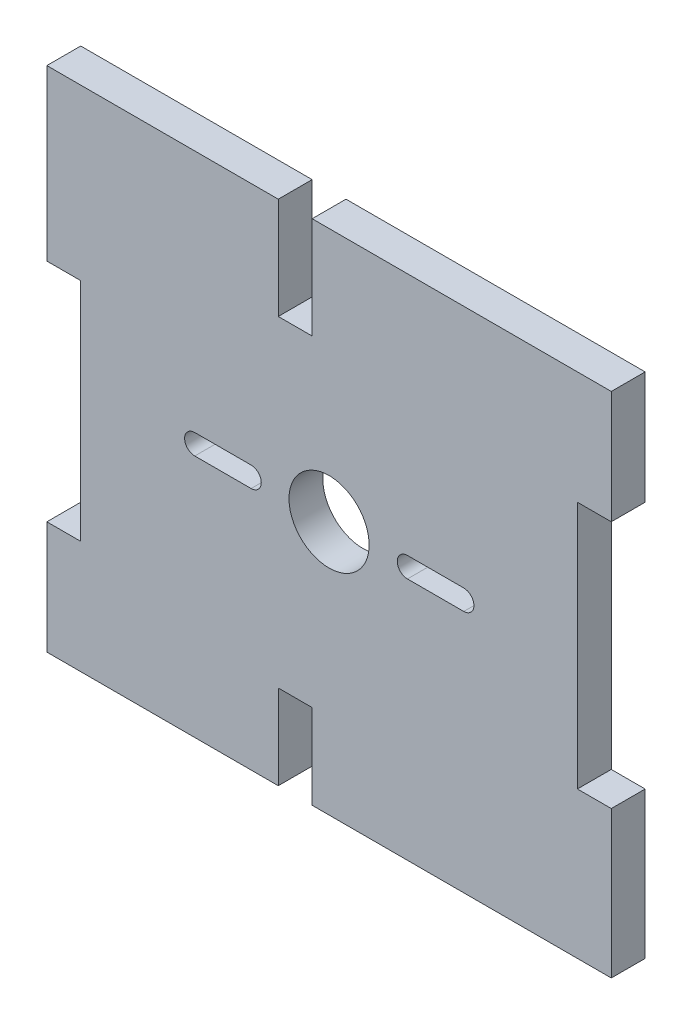
ISO-10303-21;
HEADER;
FILE_DESCRIPTION(('STEP AP214'),'2;1');
FILE_NAME('part.step','',(''),(''),'','','');
FILE_SCHEMA(('AUTOMOTIVE_DESIGN { 1 0 10303 214 1 1 1 1 }'));
ENDSEC;
DATA;
#1=APPLICATION_CONTEXT('core data for automotive mechanical design processes');
#2=APPLICATION_PROTOCOL_DEFINITION('international standard','automotive_design',2000,#1);
#3=PRODUCT_CONTEXT('',#1,'mechanical');
#4=PRODUCT('Part','Part','',(#3));
#5=PRODUCT_RELATED_PRODUCT_CATEGORY('part','',(#4));
#6=PRODUCT_DEFINITION_FORMATION('','',#4);
#7=PRODUCT_DEFINITION_CONTEXT('part definition',#1,'design');
#8=PRODUCT_DEFINITION('design','',#6,#7);
#9=PRODUCT_DEFINITION_SHAPE('','',#8);
#10=(LENGTH_UNIT() NAMED_UNIT(*) SI_UNIT(.MILLI.,.METRE.));
#11=(NAMED_UNIT(*) PLANE_ANGLE_UNIT() SI_UNIT($,.RADIAN.));
#12=(NAMED_UNIT(*) SI_UNIT($,.STERADIAN.) SOLID_ANGLE_UNIT());
#13=UNCERTAINTY_MEASURE_WITH_UNIT(LENGTH_MEASURE(1.E-05),#10,'distance_accuracy_value','');
#14=(GEOMETRIC_REPRESENTATION_CONTEXT(3) GLOBAL_UNCERTAINTY_ASSIGNED_CONTEXT((#13)) GLOBAL_UNIT_ASSIGNED_CONTEXT((#10,
#11,#12)) REPRESENTATION_CONTEXT('',''));
#15=CARTESIAN_POINT('',(0.,0.,0.));
#16=DIRECTION('',(0.,0.,1.));
#17=DIRECTION('',(1.,0.,0.));
#18=AXIS2_PLACEMENT_3D('',#15,#16,#17);
#19=CARTESIAN_POINT('',(19.6323885041378,44.9999,0.));
#20=DIRECTION('',(-1.,0.,0.));
#21=DIRECTION('',(0.,0.,1.));
#22=AXIS2_PLACEMENT_3D('',#19,#20,#21);
#23=PLANE('',#22);
#24=DIRECTION('',(0.,-1.,0.));
#25=VECTOR('',#24,1.);
#26=CARTESIAN_POINT('',(19.6323885041378,44.9999,3.));
#27=LINE('',#26,#25);
#28=CARTESIAN_POINT('',(19.6323885041378,44.9999,3.));
#29=VERTEX_POINT('',#28);
#30=CARTESIAN_POINT('',(19.6323885041378,35.9998,3.));
#31=VERTEX_POINT('',#30);
#32=EDGE_CURVE('E293',#29,#31,#27,.T.);
#33=ORIENTED_EDGE('',*,*,#32,.F.);
#34=DIRECTION('',(0.,0.,1.));
#35=VECTOR('',#34,1.);
#36=CARTESIAN_POINT('',(19.6323885041378,44.9999,0.));
#37=LINE('',#36,#35);
#38=CARTESIAN_POINT('',(19.6323885041378,44.9999,0.));
#39=VERTEX_POINT('',#38);
#40=EDGE_CURVE('E11',#39,#29,#37,.T.);
#41=ORIENTED_EDGE('',*,*,#40,.F.);
#42=DIRECTION('',(0.,-1.,0.));
#43=VECTOR('',#42,1.);
#44=CARTESIAN_POINT('',(19.6323885041378,44.9999,0.));
#45=LINE('',#44,#43);
#46=CARTESIAN_POINT('',(19.6323885041378,35.9998,0.));
#47=VERTEX_POINT('',#46);
#48=EDGE_CURVE('E296',#39,#47,#45,.T.);
#49=ORIENTED_EDGE('',*,*,#48,.T.);
#50=DIRECTION('',(0.,0.,1.));
#51=VECTOR('',#50,1.);
#52=CARTESIAN_POINT('',(19.6323885041378,35.9998,0.));
#53=LINE('',#52,#51);
#54=EDGE_CURVE('E39',#47,#31,#53,.T.);
#55=ORIENTED_EDGE('',*,*,#54,.T.);
#56=EDGE_LOOP('',(#33,#41,#49,#55));
#57=FACE_BOUND('',#56,.T.);
#58=ADVANCED_FACE('F36',(#57),#23,.T.);
#59=CARTESIAN_POINT('',(46.1318585041378,44.9999,0.));
#60=DIRECTION('',(0.,1.,0.));
#61=DIRECTION('',(0.,0.,1.));
#62=AXIS2_PLACEMENT_3D('',#59,#60,#61);
#63=PLANE('',#62);
#64=DIRECTION('',(-1.,0.,0.));
#65=VECTOR('',#64,1.);
#66=CARTESIAN_POINT('',(46.1318585041378,44.9999,3.));
#67=LINE('',#66,#65);
#68=CARTESIAN_POINT('',(46.1318585041378,44.9999,3.));
#69=VERTEX_POINT('',#68);
#70=EDGE_CURVE('E300',#69,#29,#67,.T.);
#71=ORIENTED_EDGE('',*,*,#70,.F.);
#72=DIRECTION('',(0.,0.,1.));
#73=VECTOR('',#72,1.);
#74=CARTESIAN_POINT('',(46.1318585041378,44.9999,0.));
#75=LINE('',#74,#73);
#76=CARTESIAN_POINT('',(46.1318585041378,44.9999,0.));
#77=VERTEX_POINT('',#76);
#78=EDGE_CURVE('E44',#77,#69,#75,.T.);
#79=ORIENTED_EDGE('',*,*,#78,.F.);
#80=DIRECTION('',(-1.,0.,0.));
#81=VECTOR('',#80,1.);
#82=CARTESIAN_POINT('',(46.1318585041378,44.9999,0.));
#83=LINE('',#82,#81);
#84=EDGE_CURVE('E354',#77,#39,#83,.T.);
#85=ORIENTED_EDGE('',*,*,#84,.T.);
#86=ORIENTED_EDGE('',*,*,#40,.T.);
#87=EDGE_LOOP('',(#71,#79,#85,#86));
#88=FACE_BOUND('',#87,.T.);
#89=ADVANCED_FACE('F461',(#88),#63,.T.);
#90=CARTESIAN_POINT('',(46.1318585041378,34.9994,0.));
#91=DIRECTION('',(1.,0.,0.));
#92=DIRECTION('',(0.,1.,0.));
#93=AXIS2_PLACEMENT_3D('',#90,#91,#92);
#94=PLANE('',#93);
#95=DIRECTION('',(0.,1.,0.));
#96=VECTOR('',#95,1.);
#97=CARTESIAN_POINT('',(46.1318585041378,34.9994,3.));
#98=LINE('',#97,#96);
#99=CARTESIAN_POINT('',(46.1318585041378,34.9994,3.));
#100=VERTEX_POINT('',#99);
#101=EDGE_CURVE('E410',#100,#69,#98,.T.);
#102=ORIENTED_EDGE('',*,*,#101,.F.);
#103=DIRECTION('',(0.,0.,1.));
#104=VECTOR('',#103,1.);
#105=CARTESIAN_POINT('',(46.1318585041378,34.9994,0.));
#106=LINE('',#105,#104);
#107=CARTESIAN_POINT('',(46.1318585041378,34.9994,0.));
#108=VERTEX_POINT('',#107);
#109=EDGE_CURVE('E416',#108,#100,#106,.T.);
#110=ORIENTED_EDGE('',*,*,#109,.F.);
#111=DIRECTION('',(0.,1.,0.));
#112=VECTOR('',#111,1.);
#113=CARTESIAN_POINT('',(46.1318585041378,34.9994,0.));
#114=LINE('',#113,#112);
#115=EDGE_CURVE('E351',#108,#77,#114,.T.);
#116=ORIENTED_EDGE('',*,*,#115,.T.);
#117=ORIENTED_EDGE('',*,*,#78,.T.);
#118=EDGE_LOOP('',(#102,#110,#116,#117));
#119=FACE_BOUND('',#118,.T.);
#120=ADVANCED_FACE('F529',(#119),#94,.T.);
#121=CARTESIAN_POINT('',(43.1318585041378,34.9994,0.));
#122=DIRECTION('',(0.,-1.,0.));
#123=DIRECTION('',(0.,0.,-1.));
#124=AXIS2_PLACEMENT_3D('',#121,#122,#123);
#125=PLANE('',#124);
#126=DIRECTION('',(1.,0.,0.));
#127=VECTOR('',#126,1.);
#128=CARTESIAN_POINT('',(43.1318585041378,34.9994,3.));
#129=LINE('',#128,#127);
#130=CARTESIAN_POINT('',(43.1318585041378,34.9994,3.));
#131=VERTEX_POINT('',#130);
#132=EDGE_CURVE('E407',#131,#100,#129,.T.);
#133=ORIENTED_EDGE('',*,*,#132,.F.);
#134=DIRECTION('',(0.,0.,1.));
#135=VECTOR('',#134,1.);
#136=CARTESIAN_POINT('',(43.1318585041378,34.9994,0.));
#137=LINE('',#136,#135);
#138=CARTESIAN_POINT('',(43.1318585041378,34.9994,0.));
#139=VERTEX_POINT('',#138);
#140=EDGE_CURVE('E418',#139,#131,#137,.T.);
#141=ORIENTED_EDGE('',*,*,#140,.F.);
#142=DIRECTION('',(1.,0.,0.));
#143=VECTOR('',#142,1.);
#144=CARTESIAN_POINT('',(43.1318585041378,34.9994,0.));
#145=LINE('',#144,#143);
#146=EDGE_CURVE('E348',#139,#108,#145,.T.);
#147=ORIENTED_EDGE('',*,*,#146,.T.);
#148=ORIENTED_EDGE('',*,*,#109,.T.);
#149=EDGE_LOOP('',(#133,#141,#147,#148));
#150=FACE_BOUND('',#149,.T.);
#151=ADVANCED_FACE('F527',(#150),#125,.T.);
#152=CARTESIAN_POINT('',(43.1318585041378,13.0005,0.));
#153=DIRECTION('',(1.,0.,0.));
#154=DIRECTION('',(0.,0.,-1.));
#155=AXIS2_PLACEMENT_3D('',#152,#153,#154);
#156=PLANE('',#155);
#157=DIRECTION('',(0.,1.,0.));
#158=VECTOR('',#157,1.);
#159=CARTESIAN_POINT('',(43.1318585041378,13.0005,3.));
#160=LINE('',#159,#158);
#161=CARTESIAN_POINT('',(43.1318585041378,13.0005,3.));
#162=VERTEX_POINT('',#161);
#163=EDGE_CURVE('E404',#162,#131,#160,.T.);
#164=ORIENTED_EDGE('',*,*,#163,.F.);
#165=DIRECTION('',(0.,0.,1.));
#166=VECTOR('',#165,1.);
#167=CARTESIAN_POINT('',(43.1318585041378,13.0005,0.));
#168=LINE('',#167,#166);
#169=CARTESIAN_POINT('',(43.1318585041378,13.0005,0.));
#170=VERTEX_POINT('',#169);
#171=EDGE_CURVE('E420',#170,#162,#168,.T.);
#172=ORIENTED_EDGE('',*,*,#171,.F.);
#173=DIRECTION('',(0.,1.,0.));
#174=VECTOR('',#173,1.);
#175=CARTESIAN_POINT('',(43.1318585041378,13.0005,0.));
#176=LINE('',#175,#174);
#177=EDGE_CURVE('E345',#170,#139,#176,.T.);
#178=ORIENTED_EDGE('',*,*,#177,.T.);
#179=ORIENTED_EDGE('',*,*,#140,.T.);
#180=EDGE_LOOP('',(#164,#172,#178,#179));
#181=FACE_BOUND('',#180,.T.);
#182=ADVANCED_FACE('F523',(#181),#156,.T.);
#183=CARTESIAN_POINT('',(46.1318585041378,13.0005,0.));
#184=DIRECTION('',(0.,1.,0.));
#185=DIRECTION('',(0.,0.,1.));
#186=AXIS2_PLACEMENT_3D('',#183,#184,#185);
#187=PLANE('',#186);
#188=DIRECTION('',(-1.,0.,0.));
#189=VECTOR('',#188,1.);
#190=CARTESIAN_POINT('',(46.1318585041378,13.0005,3.));
#191=LINE('',#190,#189);
#192=CARTESIAN_POINT('',(46.1318585041378,13.0005,3.));
#193=VERTEX_POINT('',#192);
#194=EDGE_CURVE('E401',#193,#162,#191,.T.);
#195=ORIENTED_EDGE('',*,*,#194,.F.);
#196=DIRECTION('',(0.,0.,1.));
#197=VECTOR('',#196,1.);
#198=CARTESIAN_POINT('',(46.1318585041378,13.0005,0.));
#199=LINE('',#198,#197);
#200=CARTESIAN_POINT('',(46.1318585041378,13.0005,0.));
#201=VERTEX_POINT('',#200);
#202=EDGE_CURVE('E422',#201,#193,#199,.T.);
#203=ORIENTED_EDGE('',*,*,#202,.F.);
#204=DIRECTION('',(-1.,0.,0.));
#205=VECTOR('',#204,1.);
#206=CARTESIAN_POINT('',(46.1318585041378,13.0005,0.));
#207=LINE('',#206,#205);
#208=EDGE_CURVE('E342',#201,#170,#207,.T.);
#209=ORIENTED_EDGE('',*,*,#208,.T.);
#210=ORIENTED_EDGE('',*,*,#171,.T.);
#211=EDGE_LOOP('',(#195,#203,#209,#210));
#212=FACE_BOUND('',#211,.T.);
#213=ADVANCED_FACE('F519',(#212),#187,.T.);
#214=CARTESIAN_POINT('',(46.1318585041378,0.,0.));
#215=DIRECTION('',(1.,0.,0.));
#216=DIRECTION('',(0.,0.,-1.));
#217=AXIS2_PLACEMENT_3D('',#214,#215,#216);
#218=PLANE('',#217);
#219=DIRECTION('',(0.,1.,0.));
#220=VECTOR('',#219,1.);
#221=CARTESIAN_POINT('',(46.1318585041378,0.,3.));
#222=LINE('',#221,#220);
#223=CARTESIAN_POINT('',(46.1318585041378,0.,3.));
#224=VERTEX_POINT('',#223);
#225=EDGE_CURVE('E398',#224,#193,#222,.T.);
#226=ORIENTED_EDGE('',*,*,#225,.F.);
#227=DIRECTION('',(0.,0.,1.));
#228=VECTOR('',#227,1.);
#229=CARTESIAN_POINT('',(46.1318585041378,0.,0.));
#230=LINE('',#229,#228);
#231=CARTESIAN_POINT('',(46.1318585041378,0.,0.));
#232=VERTEX_POINT('',#231);
#233=EDGE_CURVE('E424',#232,#224,#230,.T.);
#234=ORIENTED_EDGE('',*,*,#233,.F.);
#235=DIRECTION('',(0.,1.,0.));
#236=VECTOR('',#235,1.);
#237=CARTESIAN_POINT('',(46.1318585041378,0.,0.));
#238=LINE('',#237,#236);
#239=EDGE_CURVE('E339',#232,#201,#238,.T.);
#240=ORIENTED_EDGE('',*,*,#239,.T.);
#241=ORIENTED_EDGE('',*,*,#202,.T.);
#242=EDGE_LOOP('',(#226,#234,#240,#241));
#243=FACE_BOUND('',#242,.T.);
#244=ADVANCED_FACE('F515',(#243),#218,.T.);
#245=CARTESIAN_POINT('',(19.6323885041378,0.,0.));
#246=DIRECTION('',(0.,-1.,0.));
#247=DIRECTION('',(0.,0.,-1.));
#248=AXIS2_PLACEMENT_3D('',#245,#246,#247);
#249=PLANE('',#248);
#250=DIRECTION('',(1.,0.,0.));
#251=VECTOR('',#250,1.);
#252=CARTESIAN_POINT('',(19.6323885041378,0.,3.));
#253=LINE('',#252,#251);
#254=CARTESIAN_POINT('',(19.6323885041378,0.,3.));
#255=VERTEX_POINT('',#254);
#256=EDGE_CURVE('E395',#255,#224,#253,.T.);
#257=ORIENTED_EDGE('',*,*,#256,.F.);
#258=DIRECTION('',(0.,0.,1.));
#259=VECTOR('',#258,1.);
#260=CARTESIAN_POINT('',(19.6323885041378,0.,0.));
#261=LINE('',#260,#259);
#262=CARTESIAN_POINT('',(19.6323885041378,0.,0.));
#263=VERTEX_POINT('',#262);
#264=EDGE_CURVE('E426',#263,#255,#261,.T.);
#265=ORIENTED_EDGE('',*,*,#264,.F.);
#266=DIRECTION('',(1.,0.,0.));
#267=VECTOR('',#266,1.);
#268=CARTESIAN_POINT('',(19.6323885041378,0.,0.));
#269=LINE('',#268,#267);
#270=EDGE_CURVE('E336',#263,#232,#269,.T.);
#271=ORIENTED_EDGE('',*,*,#270,.T.);
#272=ORIENTED_EDGE('',*,*,#233,.T.);
#273=EDGE_LOOP('',(#257,#265,#271,#272));
#274=FACE_BOUND('',#273,.T.);
#275=ADVANCED_FACE('F511',(#274),#249,.T.);
#276=CARTESIAN_POINT('',(19.6323885041378,7.4993,0.));
#277=DIRECTION('',(-1.,0.,0.));
#278=DIRECTION('',(0.,0.,1.));
#279=AXIS2_PLACEMENT_3D('',#276,#277,#278);
#280=PLANE('',#279);
#281=DIRECTION('',(0.,-1.,0.));
#282=VECTOR('',#281,1.);
#283=CARTESIAN_POINT('',(19.6323885041378,7.4993,3.));
#284=LINE('',#283,#282);
#285=CARTESIAN_POINT('',(19.6323885041378,7.4993,3.));
#286=VERTEX_POINT('',#285);
#287=EDGE_CURVE('E392',#286,#255,#284,.T.);
#288=ORIENTED_EDGE('',*,*,#287,.F.);
#289=DIRECTION('',(0.,0.,1.));
#290=VECTOR('',#289,1.);
#291=CARTESIAN_POINT('',(19.6323885041378,7.4993,0.));
#292=LINE('',#291,#290);
#293=CARTESIAN_POINT('',(19.6323885041378,7.4993,0.));
#294=VERTEX_POINT('',#293);
#295=EDGE_CURVE('E428',#294,#286,#292,.T.);
#296=ORIENTED_EDGE('',*,*,#295,.F.);
#297=DIRECTION('',(0.,-1.,0.));
#298=VECTOR('',#297,1.);
#299=CARTESIAN_POINT('',(19.6323885041378,7.4993,0.));
#300=LINE('',#299,#298);
#301=EDGE_CURVE('E333',#294,#263,#300,.T.);
#302=ORIENTED_EDGE('',*,*,#301,.T.);
#303=ORIENTED_EDGE('',*,*,#264,.T.);
#304=EDGE_LOOP('',(#288,#296,#302,#303));
#305=FACE_BOUND('',#304,.T.);
#306=ADVANCED_FACE('F507',(#305),#280,.T.);
#307=CARTESIAN_POINT('',(16.6323585041377,7.4993,0.));
#308=DIRECTION('',(0.,-1.,0.));
#309=DIRECTION('',(0.,0.,-1.));
#310=AXIS2_PLACEMENT_3D('',#307,#308,#309);
#311=PLANE('',#310);
#312=DIRECTION('',(1.,0.,0.));
#313=VECTOR('',#312,1.);
#314=CARTESIAN_POINT('',(16.6323585041377,7.4993,3.));
#315=LINE('',#314,#313);
#316=CARTESIAN_POINT('',(16.6323585041377,7.4993,3.));
#317=VERTEX_POINT('',#316);
#318=EDGE_CURVE('E389',#317,#286,#315,.T.);
#319=ORIENTED_EDGE('',*,*,#318,.F.);
#320=DIRECTION('',(0.,0.,1.));
#321=VECTOR('',#320,1.);
#322=CARTESIAN_POINT('',(16.6323585041377,7.4993,0.));
#323=LINE('',#322,#321);
#324=CARTESIAN_POINT('',(16.6323585041377,7.4993,0.));
#325=VERTEX_POINT('',#324);
#326=EDGE_CURVE('E430',#325,#317,#323,.T.);
#327=ORIENTED_EDGE('',*,*,#326,.F.);
#328=DIRECTION('',(1.,0.,0.));
#329=VECTOR('',#328,1.);
#330=CARTESIAN_POINT('',(16.6323585041377,7.4993,0.));
#331=LINE('',#330,#329);
#332=EDGE_CURVE('E330',#325,#294,#331,.T.);
#333=ORIENTED_EDGE('',*,*,#332,.T.);
#334=ORIENTED_EDGE('',*,*,#295,.T.);
#335=EDGE_LOOP('',(#319,#327,#333,#334));
#336=FACE_BOUND('',#335,.T.);
#337=ADVANCED_FACE('F503',(#336),#311,.T.);
#338=CARTESIAN_POINT('',(16.6323585041377,0.,0.));
#339=DIRECTION('',(1.,0.,0.));
#340=DIRECTION('',(0.,0.,-1.));
#341=AXIS2_PLACEMENT_3D('',#338,#339,#340);
#342=PLANE('',#341);
#343=DIRECTION('',(0.,1.,0.));
#344=VECTOR('',#343,1.);
#345=CARTESIAN_POINT('',(16.6323585041377,0.,3.));
#346=LINE('',#345,#344);
#347=CARTESIAN_POINT('',(16.6323585041377,0.,3.));
#348=VERTEX_POINT('',#347);
#349=EDGE_CURVE('E386',#348,#317,#346,.T.);
#350=ORIENTED_EDGE('',*,*,#349,.F.);
#351=DIRECTION('',(0.,0.,1.));
#352=VECTOR('',#351,1.);
#353=CARTESIAN_POINT('',(16.6323585041377,0.,0.));
#354=LINE('',#353,#352);
#355=CARTESIAN_POINT('',(16.6323585041377,0.,0.));
#356=VERTEX_POINT('',#355);
#357=EDGE_CURVE('E432',#356,#348,#354,.T.);
#358=ORIENTED_EDGE('',*,*,#357,.F.);
#359=DIRECTION('',(0.,1.,0.));
#360=VECTOR('',#359,1.);
#361=CARTESIAN_POINT('',(16.6323585041377,0.,0.));
#362=LINE('',#361,#360);
#363=EDGE_CURVE('E327',#356,#325,#362,.T.);
#364=ORIENTED_EDGE('',*,*,#363,.T.);
#365=ORIENTED_EDGE('',*,*,#326,.T.);
#366=EDGE_LOOP('',(#350,#358,#364,#365));
#367=FACE_BOUND('',#366,.T.);
#368=ADVANCED_FACE('F499',(#367),#342,.T.);
#369=CARTESIAN_POINT('',(-3.86737149586228,0.,0.));
#370=DIRECTION('',(0.,-1.,0.));
#371=DIRECTION('',(0.,0.,-1.));
#372=AXIS2_PLACEMENT_3D('',#369,#370,#371);
#373=PLANE('',#372);
#374=DIRECTION('',(1.,0.,0.));
#375=VECTOR('',#374,1.);
#376=CARTESIAN_POINT('',(-3.86737149586228,0.,3.));
#377=LINE('',#376,#375);
#378=CARTESIAN_POINT('',(-3.86737149586228,0.,3.));
#379=VERTEX_POINT('',#378);
#380=EDGE_CURVE('E383',#379,#348,#377,.T.);
#381=ORIENTED_EDGE('',*,*,#380,.F.);
#382=DIRECTION('',(0.,0.,1.));
#383=VECTOR('',#382,1.);
#384=CARTESIAN_POINT('',(-3.86737149586228,0.,0.));
#385=LINE('',#384,#383);
#386=CARTESIAN_POINT('',(-3.86737149586228,0.,0.));
#387=VERTEX_POINT('',#386);
#388=EDGE_CURVE('E434',#387,#379,#385,.T.);
#389=ORIENTED_EDGE('',*,*,#388,.F.);
#390=DIRECTION('',(1.,0.,0.));
#391=VECTOR('',#390,1.);
#392=CARTESIAN_POINT('',(-3.86737149586228,0.,0.));
#393=LINE('',#392,#391);
#394=EDGE_CURVE('E324',#387,#356,#393,.T.);
#395=ORIENTED_EDGE('',*,*,#394,.T.);
#396=ORIENTED_EDGE('',*,*,#357,.T.);
#397=EDGE_LOOP('',(#381,#389,#395,#396));
#398=FACE_BOUND('',#397,.T.);
#399=ADVANCED_FACE('F495',(#398),#373,.T.);
#400=CARTESIAN_POINT('',(-3.86737149586228,9.9991,0.));
#401=DIRECTION('',(-1.,0.,0.));
#402=DIRECTION('',(0.,-1.,0.));
#403=AXIS2_PLACEMENT_3D('',#400,#401,#402);
#404=PLANE('',#403);
#405=DIRECTION('',(0.,-1.,0.));
#406=VECTOR('',#405,1.);
#407=CARTESIAN_POINT('',(-3.86737149586228,9.9991,3.));
#408=LINE('',#407,#406);
#409=CARTESIAN_POINT('',(-3.86737149586228,9.9991,3.));
#410=VERTEX_POINT('',#409);
#411=EDGE_CURVE('E380',#410,#379,#408,.T.);
#412=ORIENTED_EDGE('',*,*,#411,.F.);
#413=DIRECTION('',(0.,0.,1.));
#414=VECTOR('',#413,1.);
#415=CARTESIAN_POINT('',(-3.86737149586228,9.9991,0.));
#416=LINE('',#415,#414);
#417=CARTESIAN_POINT('',(-3.86737149586228,9.9991,0.));
#418=VERTEX_POINT('',#417);
#419=EDGE_CURVE('E436',#418,#410,#416,.T.);
#420=ORIENTED_EDGE('',*,*,#419,.F.);
#421=DIRECTION('',(0.,-1.,0.));
#422=VECTOR('',#421,1.);
#423=CARTESIAN_POINT('',(-3.86737149586228,9.9991,0.));
#424=LINE('',#423,#422);
#425=EDGE_CURVE('E321',#418,#387,#424,.T.);
#426=ORIENTED_EDGE('',*,*,#425,.T.);
#427=ORIENTED_EDGE('',*,*,#388,.T.);
#428=EDGE_LOOP('',(#412,#420,#426,#427));
#429=FACE_BOUND('',#428,.T.);
#430=ADVANCED_FACE('F491',(#429),#404,.T.);
#431=CARTESIAN_POINT('',(-0.867341495862278,9.9991,0.));
#432=DIRECTION('',(0.,1.,0.));
#433=DIRECTION('',(0.,0.,1.));
#434=AXIS2_PLACEMENT_3D('',#431,#432,#433);
#435=PLANE('',#434);
#436=DIRECTION('',(-1.,0.,0.));
#437=VECTOR('',#436,1.);
#438=CARTESIAN_POINT('',(-0.867341495862278,9.9991,3.));
#439=LINE('',#438,#437);
#440=CARTESIAN_POINT('',(-0.867341495862278,9.9991,3.));
#441=VERTEX_POINT('',#440);
#442=EDGE_CURVE('E377',#441,#410,#439,.T.);
#443=ORIENTED_EDGE('',*,*,#442,.F.);
#444=DIRECTION('',(0.,0.,1.));
#445=VECTOR('',#444,1.);
#446=CARTESIAN_POINT('',(-0.867341495862278,9.9991,0.));
#447=LINE('',#446,#445);
#448=CARTESIAN_POINT('',(-0.867341495862278,9.9991,0.));
#449=VERTEX_POINT('',#448);
#450=EDGE_CURVE('E438',#449,#441,#447,.T.);
#451=ORIENTED_EDGE('',*,*,#450,.F.);
#452=DIRECTION('',(-1.,0.,0.));
#453=VECTOR('',#452,1.);
#454=CARTESIAN_POINT('',(-0.867341495862278,9.9991,0.));
#455=LINE('',#454,#453);
#456=EDGE_CURVE('E318',#449,#418,#455,.T.);
#457=ORIENTED_EDGE('',*,*,#456,.T.);
#458=ORIENTED_EDGE('',*,*,#419,.T.);
#459=EDGE_LOOP('',(#443,#451,#457,#458));
#460=FACE_BOUND('',#459,.T.);
#461=ADVANCED_FACE('F487',(#460),#435,.T.);
#462=CARTESIAN_POINT('',(-0.867341495862278,29.9998,0.));
#463=DIRECTION('',(-1.,0.,0.));
#464=DIRECTION('',(0.,0.,1.));
#465=AXIS2_PLACEMENT_3D('',#462,#463,#464);
#466=PLANE('',#465);
#467=DIRECTION('',(0.,-1.,0.));
#468=VECTOR('',#467,1.);
#469=CARTESIAN_POINT('',(-0.867341495862278,29.9998,3.));
#470=LINE('',#469,#468);
#471=CARTESIAN_POINT('',(-0.867341495862278,29.9998,3.));
#472=VERTEX_POINT('',#471);
#473=EDGE_CURVE('E374',#472,#441,#470,.T.);
#474=ORIENTED_EDGE('',*,*,#473,.F.);
#475=DIRECTION('',(0.,0.,1.));
#476=VECTOR('',#475,1.);
#477=CARTESIAN_POINT('',(-0.867341495862278,29.9998,0.));
#478=LINE('',#477,#476);
#479=CARTESIAN_POINT('',(-0.867341495862278,29.9998,0.));
#480=VERTEX_POINT('',#479);
#481=EDGE_CURVE('E440',#480,#472,#478,.T.);
#482=ORIENTED_EDGE('',*,*,#481,.F.);
#483=DIRECTION('',(0.,-1.,0.));
#484=VECTOR('',#483,1.);
#485=CARTESIAN_POINT('',(-0.867341495862278,29.9998,0.));
#486=LINE('',#485,#484);
#487=EDGE_CURVE('E315',#480,#449,#486,.T.);
#488=ORIENTED_EDGE('',*,*,#487,.T.);
#489=ORIENTED_EDGE('',*,*,#450,.T.);
#490=EDGE_LOOP('',(#474,#482,#488,#489));
#491=FACE_BOUND('',#490,.T.);
#492=ADVANCED_FACE('F483',(#491),#466,.T.);
#493=CARTESIAN_POINT('',(-3.86737149586228,29.9998,0.));
#494=DIRECTION('',(0.,-1.,0.));
#495=DIRECTION('',(0.,0.,-1.));
#496=AXIS2_PLACEMENT_3D('',#493,#494,#495);
#497=PLANE('',#496);
#498=DIRECTION('',(1.,0.,0.));
#499=VECTOR('',#498,1.);
#500=CARTESIAN_POINT('',(-3.86737149586228,29.9998,3.));
#501=LINE('',#500,#499);
#502=CARTESIAN_POINT('',(-3.86737149586228,29.9998,3.));
#503=VERTEX_POINT('',#502);
#504=EDGE_CURVE('E371',#503,#472,#501,.T.);
#505=ORIENTED_EDGE('',*,*,#504,.F.);
#506=DIRECTION('',(0.,0.,1.));
#507=VECTOR('',#506,1.);
#508=CARTESIAN_POINT('',(-3.86737149586228,29.9998,0.));
#509=LINE('',#508,#507);
#510=CARTESIAN_POINT('',(-3.86737149586228,29.9998,0.));
#511=VERTEX_POINT('',#510);
#512=EDGE_CURVE('E442',#511,#503,#509,.T.);
#513=ORIENTED_EDGE('',*,*,#512,.F.);
#514=DIRECTION('',(1.,0.,0.));
#515=VECTOR('',#514,1.);
#516=CARTESIAN_POINT('',(-3.86737149586228,29.9998,0.));
#517=LINE('',#516,#515);
#518=EDGE_CURVE('E312',#511,#480,#517,.T.);
#519=ORIENTED_EDGE('',*,*,#518,.T.);
#520=ORIENTED_EDGE('',*,*,#481,.T.);
#521=EDGE_LOOP('',(#505,#513,#519,#520));
#522=FACE_BOUND('',#521,.T.);
#523=ADVANCED_FACE('F479',(#522),#497,.T.);
#524=CARTESIAN_POINT('',(-3.86737149586228,44.9999,0.));
#525=DIRECTION('',(-1.,0.,0.));
#526=DIRECTION('',(0.,0.,1.));
#527=AXIS2_PLACEMENT_3D('',#524,#525,#526);
#528=PLANE('',#527);
#529=DIRECTION('',(0.,-1.,0.));
#530=VECTOR('',#529,1.);
#531=CARTESIAN_POINT('',(-3.86737149586228,44.9999,3.));
#532=LINE('',#531,#530);
#533=CARTESIAN_POINT('',(-3.86737149586228,44.9999,3.));
#534=VERTEX_POINT('',#533);
#535=EDGE_CURVE('E368',#534,#503,#532,.T.);
#536=ORIENTED_EDGE('',*,*,#535,.F.);
#537=DIRECTION('',(0.,0.,1.));
#538=VECTOR('',#537,1.);
#539=CARTESIAN_POINT('',(-3.86737149586228,44.9999,0.));
#540=LINE('',#539,#538);
#541=CARTESIAN_POINT('',(-3.86737149586228,44.9999,0.));
#542=VERTEX_POINT('',#541);
#543=EDGE_CURVE('E444',#542,#534,#540,.T.);
#544=ORIENTED_EDGE('',*,*,#543,.F.);
#545=DIRECTION('',(0.,-1.,0.));
#546=VECTOR('',#545,1.);
#547=CARTESIAN_POINT('',(-3.86737149586228,44.9999,0.));
#548=LINE('',#547,#546);
#549=EDGE_CURVE('E309',#542,#511,#548,.T.);
#550=ORIENTED_EDGE('',*,*,#549,.T.);
#551=ORIENTED_EDGE('',*,*,#512,.T.);
#552=EDGE_LOOP('',(#536,#544,#550,#551));
#553=FACE_BOUND('',#552,.T.);
#554=ADVANCED_FACE('F475',(#553),#528,.T.);
#555=CARTESIAN_POINT('',(16.6323585041377,44.9999,0.));
#556=DIRECTION('',(0.,1.,0.));
#557=DIRECTION('',(0.,0.,1.));
#558=AXIS2_PLACEMENT_3D('',#555,#556,#557);
#559=PLANE('',#558);
#560=DIRECTION('',(-1.,0.,0.));
#561=VECTOR('',#560,1.);
#562=CARTESIAN_POINT('',(16.6323585041377,44.9999,3.));
#563=LINE('',#562,#561);
#564=CARTESIAN_POINT('',(16.6323585041377,44.9999,3.));
#565=VERTEX_POINT('',#564);
#566=EDGE_CURVE('E365',#565,#534,#563,.T.);
#567=ORIENTED_EDGE('',*,*,#566,.F.);
#568=DIRECTION('',(0.,0.,1.));
#569=VECTOR('',#568,1.);
#570=CARTESIAN_POINT('',(16.6323585041377,44.9999,0.));
#571=LINE('',#570,#569);
#572=CARTESIAN_POINT('',(16.6323585041377,44.9999,0.));
#573=VERTEX_POINT('',#572);
#574=EDGE_CURVE('E446',#573,#565,#571,.T.);
#575=ORIENTED_EDGE('',*,*,#574,.F.);
#576=DIRECTION('',(-1.,0.,0.));
#577=VECTOR('',#576,1.);
#578=CARTESIAN_POINT('',(16.6323585041377,44.9999,0.));
#579=LINE('',#578,#577);
#580=EDGE_CURVE('E306',#573,#542,#579,.T.);
#581=ORIENTED_EDGE('',*,*,#580,.T.);
#582=ORIENTED_EDGE('',*,*,#543,.T.);
#583=EDGE_LOOP('',(#567,#575,#581,#582));
#584=FACE_BOUND('',#583,.T.);
#585=ADVANCED_FACE('F473',(#584),#559,.T.);
#586=CARTESIAN_POINT('',(16.6323585041377,35.9998,0.));
#587=DIRECTION('',(1.,0.,0.));
#588=DIRECTION('',(0.,0.,-1.));
#589=AXIS2_PLACEMENT_3D('',#586,#587,#588);
#590=PLANE('',#589);
#591=DIRECTION('',(0.,1.,0.));
#592=VECTOR('',#591,1.);
#593=CARTESIAN_POINT('',(16.6323585041377,35.9998,3.));
#594=LINE('',#593,#592);
#595=CARTESIAN_POINT('',(16.6323585041377,35.9998,3.));
#596=VERTEX_POINT('',#595);
#597=EDGE_CURVE('E362',#596,#565,#594,.T.);
#598=ORIENTED_EDGE('',*,*,#597,.F.);
#599=DIRECTION('',(0.,0.,1.));
#600=VECTOR('',#599,1.);
#601=CARTESIAN_POINT('',(16.6323585041377,35.9998,0.));
#602=LINE('',#601,#600);
#603=CARTESIAN_POINT('',(16.6323585041377,35.9998,0.));
#604=VERTEX_POINT('',#603);
#605=EDGE_CURVE('E447',#604,#596,#602,.T.);
#606=ORIENTED_EDGE('',*,*,#605,.F.);
#607=DIRECTION('',(0.,1.,0.));
#608=VECTOR('',#607,1.);
#609=CARTESIAN_POINT('',(16.6323585041377,35.9998,0.));
#610=LINE('',#609,#608);
#611=EDGE_CURVE('E303',#604,#573,#610,.T.);
#612=ORIENTED_EDGE('',*,*,#611,.T.);
#613=ORIENTED_EDGE('',*,*,#574,.T.);
#614=EDGE_LOOP('',(#598,#606,#612,#613));
#615=FACE_BOUND('',#614,.T.);
#616=ADVANCED_FACE('F469',(#615),#590,.T.);
#617=CARTESIAN_POINT('',(19.6323885041378,35.9998,0.));
#618=DIRECTION('',(0.,1.,0.));
#619=DIRECTION('',(0.,0.,1.));
#620=AXIS2_PLACEMENT_3D('',#617,#618,#619);
#621=PLANE('',#620);
#622=DIRECTION('',(-1.,0.,0.));
#623=VECTOR('',#622,1.);
#624=CARTESIAN_POINT('',(19.6323885041378,35.9998,3.));
#625=LINE('',#624,#623);
#626=EDGE_CURVE('E359',#31,#596,#625,.T.);
#627=ORIENTED_EDGE('',*,*,#626,.F.);
#628=ORIENTED_EDGE('',*,*,#54,.F.);
#629=DIRECTION('',(-1.,0.,0.));
#630=VECTOR('',#629,1.);
#631=CARTESIAN_POINT('',(19.6323885041378,35.9998,0.));
#632=LINE('',#631,#630);
#633=EDGE_CURVE('E299',#47,#604,#632,.T.);
#634=ORIENTED_EDGE('',*,*,#633,.T.);
#635=ORIENTED_EDGE('',*,*,#605,.T.);
#636=EDGE_LOOP('',(#627,#628,#634,#635));
#637=FACE_BOUND('',#636,.T.);
#638=ADVANCED_FACE('F455',(#637),#621,.T.);
#639=CARTESIAN_POINT('',(0.,0.,0.));
#640=DIRECTION('',(0.,0.,-1.));
#641=DIRECTION('',(-1.,0.,0.));
#642=AXIS2_PLACEMENT_3D('',#639,#640,#641);
#643=PLANE('',#642);
#644=CARTESIAN_POINT('',(14.2265894947226,22.49925,0.));
#645=DIRECTION('',(0.,0.,1.));
#646=DIRECTION('',(-1.,0.,0.));
#647=AXIS2_PLACEMENT_3D('',#644,#645,#646);
#648=CIRCLE('',#647,0.899749999999999);
#649=CARTESIAN_POINT('',(14.2265894947226,21.5995,0.));
#650=VERTEX_POINT('',#649);
#651=CARTESIAN_POINT('',(14.2265894947226,23.399,0.));
#652=VERTEX_POINT('',#651);
#653=EDGE_CURVE('E223',#650,#652,#648,.T.);
#654=ORIENTED_EDGE('',*,*,#653,.T.);
#655=DIRECTION('',(-1.,0.,0.));
#656=VECTOR('',#655,1.);
#657=CARTESIAN_POINT('',(9.23668461782303,23.399,0.));
#658=LINE('',#657,#656);
#659=CARTESIAN_POINT('',(9.23668461782303,23.399,0.));
#660=VERTEX_POINT('',#659);
#661=EDGE_CURVE('E232',#652,#660,#658,.T.);
#662=ORIENTED_EDGE('',*,*,#661,.T.);
#663=CARTESIAN_POINT('',(9.23668461782303,22.49925,0.));
#664=DIRECTION('',(0.,0.,1.));
#665=DIRECTION('',(-1.,0.,0.));
#666=AXIS2_PLACEMENT_3D('',#663,#664,#665);
#667=CIRCLE('',#666,0.899749999999999);
#668=CARTESIAN_POINT('',(9.23668461782303,21.5995,0.));
#669=VERTEX_POINT('',#668);
#670=EDGE_CURVE('E52',#660,#669,#667,.T.);
#671=ORIENTED_EDGE('',*,*,#670,.T.);
#672=DIRECTION('',(1.,0.,0.));
#673=VECTOR('',#672,1.);
#674=CARTESIAN_POINT('',(14.2265894947226,21.5995,0.));
#675=LINE('',#674,#673);
#676=EDGE_CURVE('E229',#669,#650,#675,.T.);
#677=ORIENTED_EDGE('',*,*,#676,.T.);
#678=EDGE_LOOP('',(#654,#662,#671,#677));
#679=FACE_BOUND('',#678,.T.);
#680=CARTESIAN_POINT('',(28.074484617823,22.48685,0.));
#681=DIRECTION('',(0.,0.,1.));
#682=DIRECTION('',(-1.,0.,0.));
#683=AXIS2_PLACEMENT_3D('',#680,#681,#682);
#684=CIRCLE('',#683,0.899749999999999);
#685=CARTESIAN_POINT('',(28.074484617823,23.3866,0.));
#686=VERTEX_POINT('',#685);
#687=CARTESIAN_POINT('',(28.074484617823,21.5871,0.));
#688=VERTEX_POINT('',#687);
#689=EDGE_CURVE('E258',#686,#688,#684,.T.);
#690=ORIENTED_EDGE('',*,*,#689,.T.);
#691=DIRECTION('',(1.,0.,0.));
#692=VECTOR('',#691,1.);
#693=CARTESIAN_POINT('',(33.0643894947225,21.5871,0.));
#694=LINE('',#693,#692);
#695=CARTESIAN_POINT('',(33.0643894947225,21.5871,0.));
#696=VERTEX_POINT('',#695);
#697=EDGE_CURVE('E261',#688,#696,#694,.T.);
#698=ORIENTED_EDGE('',*,*,#697,.T.);
#699=CARTESIAN_POINT('',(33.0643894947225,22.48685,0.));
#700=DIRECTION('',(0.,0.,1.));
#701=DIRECTION('',(-1.,0.,0.));
#702=AXIS2_PLACEMENT_3D('',#699,#700,#701);
#703=CIRCLE('',#702,0.899749999999999);
#704=CARTESIAN_POINT('',(33.0643894947225,23.3866,0.));
#705=VERTEX_POINT('',#704);
#706=EDGE_CURVE('E265',#696,#705,#703,.T.);
#707=ORIENTED_EDGE('',*,*,#706,.T.);
#708=DIRECTION('',(-1.,0.,0.));
#709=VECTOR('',#708,1.);
#710=CARTESIAN_POINT('',(28.074484617823,23.3866,0.));
#711=LINE('',#710,#709);
#712=EDGE_CURVE('E268',#705,#686,#711,.T.);
#713=ORIENTED_EDGE('',*,*,#712,.T.);
#714=EDGE_LOOP('',(#690,#698,#707,#713));
#715=FACE_BOUND('',#714,.T.);
#716=CARTESIAN_POINT('',(21.1316585041378,22.4992,0.));
#717=DIRECTION('',(0.,0.,1.));
#718=DIRECTION('',(-1.,0.,0.));
#719=AXIS2_PLACEMENT_3D('',#716,#717,#718);
#720=CIRCLE('',#719,3.55);
#721=CARTESIAN_POINT('',(17.5816585041377,22.4992,0.));
#722=VERTEX_POINT('',#721);
#723=EDGE_CURVE('E290',#722,#722,#720,.T.);
#724=ORIENTED_EDGE('',*,*,#723,.T.);
#725=EDGE_LOOP('',(#724));
#726=FACE_BOUND('',#725,.T.);
#727=ORIENTED_EDGE('',*,*,#48,.F.);
#728=ORIENTED_EDGE('',*,*,#84,.F.);
#729=ORIENTED_EDGE('',*,*,#115,.F.);
#730=ORIENTED_EDGE('',*,*,#146,.F.);
#731=ORIENTED_EDGE('',*,*,#177,.F.);
#732=ORIENTED_EDGE('',*,*,#208,.F.);
#733=ORIENTED_EDGE('',*,*,#239,.F.);
#734=ORIENTED_EDGE('',*,*,#270,.F.);
#735=ORIENTED_EDGE('',*,*,#301,.F.);
#736=ORIENTED_EDGE('',*,*,#332,.F.);
#737=ORIENTED_EDGE('',*,*,#363,.F.);
#738=ORIENTED_EDGE('',*,*,#394,.F.);
#739=ORIENTED_EDGE('',*,*,#425,.F.);
#740=ORIENTED_EDGE('',*,*,#456,.F.);
#741=ORIENTED_EDGE('',*,*,#487,.F.);
#742=ORIENTED_EDGE('',*,*,#518,.F.);
#743=ORIENTED_EDGE('',*,*,#549,.F.);
#744=ORIENTED_EDGE('',*,*,#580,.F.);
#745=ORIENTED_EDGE('',*,*,#611,.F.);
#746=ORIENTED_EDGE('',*,*,#633,.F.);
#747=EDGE_LOOP('',(#727,#728,#729,#730,#731,#732,#733,#734,#735,#736,#737,#738,#739,#740,#741,
#742,#743,#744,#745,#746));
#748=FACE_BOUND('',#747,.T.);
#749=ADVANCED_FACE('F236',(#679,#715,#726,#748),#643,.T.);
#750=CARTESIAN_POINT('',(0.,0.,3.));
#751=DIRECTION('',(0.,0.,-1.));
#752=DIRECTION('',(-1.,0.,0.));
#753=AXIS2_PLACEMENT_3D('',#750,#751,#752);
#754=PLANE('',#753);
#755=DIRECTION('',(-1.,0.,0.));
#756=VECTOR('',#755,1.);
#757=CARTESIAN_POINT('',(9.23668461782303,23.399,3.));
#758=LINE('',#757,#756);
#759=CARTESIAN_POINT('',(14.2265894947226,23.399,3.));
#760=VERTEX_POINT('',#759);
#761=CARTESIAN_POINT('',(9.23668461782303,23.399,3.));
#762=VERTEX_POINT('',#761);
#763=EDGE_CURVE('E248',#760,#762,#758,.T.);
#764=ORIENTED_EDGE('',*,*,#763,.F.);
#765=CARTESIAN_POINT('',(14.2265894947226,22.49925,3.));
#766=DIRECTION('',(0.,0.,1.));
#767=DIRECTION('',(-1.,0.,0.));
#768=AXIS2_PLACEMENT_3D('',#765,#766,#767);
#769=CIRCLE('',#768,0.899749999999999);
#770=CARTESIAN_POINT('',(14.2265894947226,21.5995,3.));
#771=VERTEX_POINT('',#770);
#772=EDGE_CURVE('E60',#771,#760,#769,.T.);
#773=ORIENTED_EDGE('',*,*,#772,.F.);
#774=DIRECTION('',(1.,0.,0.));
#775=VECTOR('',#774,1.);
#776=CARTESIAN_POINT('',(14.2265894947226,21.5995,3.));
#777=LINE('',#776,#775);
#778=CARTESIAN_POINT('',(9.23668461782303,21.5995,3.));
#779=VERTEX_POINT('',#778);
#780=EDGE_CURVE('E239',#779,#771,#777,.T.);
#781=ORIENTED_EDGE('',*,*,#780,.F.);
#782=CARTESIAN_POINT('',(9.23668461782303,22.49925,3.));
#783=DIRECTION('',(0.,0.,1.));
#784=DIRECTION('',(-1.,0.,0.));
#785=AXIS2_PLACEMENT_3D('',#782,#783,#784);
#786=CIRCLE('',#785,0.899749999999999);
#787=EDGE_CURVE('E242',#762,#779,#786,.T.);
#788=ORIENTED_EDGE('',*,*,#787,.F.);
#789=EDGE_LOOP('',(#764,#773,#781,#788));
#790=FACE_BOUND('',#789,.T.);
#791=DIRECTION('',(1.,0.,0.));
#792=VECTOR('',#791,1.);
#793=CARTESIAN_POINT('',(33.0643894947225,21.5871,3.));
#794=LINE('',#793,#792);
#795=CARTESIAN_POINT('',(28.074484617823,21.5871,3.));
#796=VERTEX_POINT('',#795);
#797=CARTESIAN_POINT('',(33.0643894947225,21.5871,3.));
#798=VERTEX_POINT('',#797);
#799=EDGE_CURVE('E273',#796,#798,#794,.T.);
#800=ORIENTED_EDGE('',*,*,#799,.F.);
#801=CARTESIAN_POINT('',(28.074484617823,22.48685,3.));
#802=DIRECTION('',(0.,0.,1.));
#803=DIRECTION('',(-1.,0.,0.));
#804=AXIS2_PLACEMENT_3D('',#801,#802,#803);
#805=CIRCLE('',#804,0.899749999999999);
#806=CARTESIAN_POINT('',(28.074484617823,23.3866,3.));
#807=VERTEX_POINT('',#806);
#808=EDGE_CURVE('E254',#807,#796,#805,.T.);
#809=ORIENTED_EDGE('',*,*,#808,.F.);
#810=DIRECTION('',(-1.,0.,0.));
#811=VECTOR('',#810,1.);
#812=CARTESIAN_POINT('',(28.074484617823,23.3866,3.));
#813=LINE('',#812,#811);
#814=CARTESIAN_POINT('',(33.0643894947225,23.3866,3.));
#815=VERTEX_POINT('',#814);
#816=EDGE_CURVE('E262',#815,#807,#813,.T.);
#817=ORIENTED_EDGE('',*,*,#816,.F.);
#818=CARTESIAN_POINT('',(33.0643894947225,22.48685,3.));
#819=DIRECTION('',(0.,0.,1.));
#820=DIRECTION('',(-1.,0.,0.));
#821=AXIS2_PLACEMENT_3D('',#818,#819,#820);
#822=CIRCLE('',#821,0.899749999999999);
#823=EDGE_CURVE('E276',#798,#815,#822,.T.);
#824=ORIENTED_EDGE('',*,*,#823,.F.);
#825=EDGE_LOOP('',(#800,#809,#817,#824));
#826=FACE_BOUND('',#825,.T.);
#827=CARTESIAN_POINT('',(21.1316585041378,22.4992,3.));
#828=DIRECTION('',(0.,0.,1.));
#829=DIRECTION('',(-1.,0.,0.));
#830=AXIS2_PLACEMENT_3D('',#827,#828,#829);
#831=CIRCLE('',#830,3.55);
#832=CARTESIAN_POINT('',(17.5816585041377,22.4992,3.));
#833=VERTEX_POINT('',#832);
#834=EDGE_CURVE('E283',#833,#833,#831,.T.);
#835=ORIENTED_EDGE('',*,*,#834,.F.);
#836=EDGE_LOOP('',(#835));
#837=FACE_BOUND('',#836,.T.);
#838=ORIENTED_EDGE('',*,*,#32,.T.);
#839=ORIENTED_EDGE('',*,*,#626,.T.);
#840=ORIENTED_EDGE('',*,*,#597,.T.);
#841=ORIENTED_EDGE('',*,*,#566,.T.);
#842=ORIENTED_EDGE('',*,*,#535,.T.);
#843=ORIENTED_EDGE('',*,*,#504,.T.);
#844=ORIENTED_EDGE('',*,*,#473,.T.);
#845=ORIENTED_EDGE('',*,*,#442,.T.);
#846=ORIENTED_EDGE('',*,*,#411,.T.);
#847=ORIENTED_EDGE('',*,*,#380,.T.);
#848=ORIENTED_EDGE('',*,*,#349,.T.);
#849=ORIENTED_EDGE('',*,*,#318,.T.);
#850=ORIENTED_EDGE('',*,*,#287,.T.);
#851=ORIENTED_EDGE('',*,*,#256,.T.);
#852=ORIENTED_EDGE('',*,*,#225,.T.);
#853=ORIENTED_EDGE('',*,*,#194,.T.);
#854=ORIENTED_EDGE('',*,*,#163,.T.);
#855=ORIENTED_EDGE('',*,*,#132,.T.);
#856=ORIENTED_EDGE('',*,*,#101,.T.);
#857=ORIENTED_EDGE('',*,*,#70,.T.);
#858=EDGE_LOOP('',(#838,#839,#840,#841,#842,#843,#844,#845,#846,#847,#848,#849,#850,#851,#852,
#853,#854,#855,#856,#857));
#859=FACE_BOUND('',#858,.T.);
#860=ADVANCED_FACE('F457',(#790,#826,#837,#859),#754,.F.);
#861=CARTESIAN_POINT('',(21.1316585041378,22.4992,0.));
#862=DIRECTION('',(0.,0.,1.));
#863=DIRECTION('',(1.,0.,0.));
#864=AXIS2_PLACEMENT_3D('',#861,#862,#863);
#865=CYLINDRICAL_SURFACE('',#864,3.55);
#866=ORIENTED_EDGE('',*,*,#723,.F.);
#867=EDGE_LOOP('',(#866));
#868=FACE_BOUND('',#867,.T.);
#869=ORIENTED_EDGE('',*,*,#834,.T.);
#870=EDGE_LOOP('',(#869));
#871=FACE_BOUND('',#870,.T.);
#872=ADVANCED_FACE('F699',(#868,#871),#865,.F.);
#873=CARTESIAN_POINT('',(28.074484617823,22.48685,0.));
#874=DIRECTION('',(0.,0.,1.));
#875=DIRECTION('',(1.,0.,0.));
#876=AXIS2_PLACEMENT_3D('',#873,#874,#875);
#877=CYLINDRICAL_SURFACE('',#876,0.899749999999999);
#878=ORIENTED_EDGE('',*,*,#808,.T.);
#879=DIRECTION('',(0.,0.,1.));
#880=VECTOR('',#879,1.);
#881=CARTESIAN_POINT('',(28.074484617823,21.5871,0.));
#882=LINE('',#881,#880);
#883=EDGE_CURVE('E271',#688,#796,#882,.T.);
#884=ORIENTED_EDGE('',*,*,#883,.F.);
#885=ORIENTED_EDGE('',*,*,#689,.F.);
#886=DIRECTION('',(0.,0.,1.));
#887=VECTOR('',#886,1.);
#888=CARTESIAN_POINT('',(28.074484617823,23.3866,0.));
#889=LINE('',#888,#887);
#890=EDGE_CURVE('E281',#686,#807,#889,.T.);
#891=ORIENTED_EDGE('',*,*,#890,.T.);
#892=EDGE_LOOP('',(#878,#884,#885,#891));
#893=FACE_BOUND('',#892,.T.);
#894=ADVANCED_FACE('F709',(#893),#877,.F.);
#895=CARTESIAN_POINT('',(28.074484617823,23.3866,0.));
#896=DIRECTION('',(0.,1.,0.));
#897=DIRECTION('',(0.,0.,1.));
#898=AXIS2_PLACEMENT_3D('',#895,#896,#897);
#899=PLANE('',#898);
#900=ORIENTED_EDGE('',*,*,#816,.T.);
#901=ORIENTED_EDGE('',*,*,#890,.F.);
#902=ORIENTED_EDGE('',*,*,#712,.F.);
#903=DIRECTION('',(0.,0.,1.));
#904=VECTOR('',#903,1.);
#905=CARTESIAN_POINT('',(33.0643894947225,23.3866,0.));
#906=LINE('',#905,#904);
#907=EDGE_CURVE('E284',#705,#815,#906,.T.);
#908=ORIENTED_EDGE('',*,*,#907,.T.);
#909=EDGE_LOOP('',(#900,#901,#902,#908));
#910=FACE_BOUND('',#909,.T.);
#911=ADVANCED_FACE('F719',(#910),#899,.F.);
#912=CARTESIAN_POINT('',(33.0643894947225,22.48685,0.));
#913=DIRECTION('',(0.,0.,1.));
#914=DIRECTION('',(1.,0.,0.));
#915=AXIS2_PLACEMENT_3D('',#912,#913,#914);
#916=CYLINDRICAL_SURFACE('',#915,0.899749999999999);
#917=ORIENTED_EDGE('',*,*,#823,.T.);
#918=ORIENTED_EDGE('',*,*,#907,.F.);
#919=ORIENTED_EDGE('',*,*,#706,.F.);
#920=DIRECTION('',(0.,0.,1.));
#921=VECTOR('',#920,1.);
#922=CARTESIAN_POINT('',(33.0643894947225,21.5871,0.));
#923=LINE('',#922,#921);
#924=EDGE_CURVE('E286',#696,#798,#923,.T.);
#925=ORIENTED_EDGE('',*,*,#924,.T.);
#926=EDGE_LOOP('',(#917,#918,#919,#925));
#927=FACE_BOUND('',#926,.T.);
#928=ADVANCED_FACE('F729',(#927),#916,.F.);
#929=CARTESIAN_POINT('',(33.0643894947225,21.5871,0.));
#930=DIRECTION('',(0.,-1.,0.));
#931=DIRECTION('',(0.,0.,-1.));
#932=AXIS2_PLACEMENT_3D('',#929,#930,#931);
#933=PLANE('',#932);
#934=ORIENTED_EDGE('',*,*,#799,.T.);
#935=ORIENTED_EDGE('',*,*,#924,.F.);
#936=ORIENTED_EDGE('',*,*,#697,.F.);
#937=ORIENTED_EDGE('',*,*,#883,.T.);
#938=EDGE_LOOP('',(#934,#935,#936,#937));
#939=FACE_BOUND('',#938,.T.);
#940=ADVANCED_FACE('F739',(#939),#933,.F.);
#941=CARTESIAN_POINT('',(14.2265894947226,22.49925,0.));
#942=DIRECTION('',(0.,0.,1.));
#943=DIRECTION('',(1.,0.,0.));
#944=AXIS2_PLACEMENT_3D('',#941,#942,#943);
#945=CYLINDRICAL_SURFACE('',#944,0.899749999999999);
#946=ORIENTED_EDGE('',*,*,#772,.T.);
#947=DIRECTION('',(0.,0.,1.));
#948=VECTOR('',#947,1.);
#949=CARTESIAN_POINT('',(14.2265894947226,23.399,0.));
#950=LINE('',#949,#948);
#951=EDGE_CURVE('E219',#652,#760,#950,.T.);
#952=ORIENTED_EDGE('',*,*,#951,.F.);
#953=ORIENTED_EDGE('',*,*,#653,.F.);
#954=DIRECTION('',(0.,0.,1.));
#955=VECTOR('',#954,1.);
#956=CARTESIAN_POINT('',(14.2265894947226,21.5995,0.));
#957=LINE('',#956,#955);
#958=EDGE_CURVE('E252',#650,#771,#957,.T.);
#959=ORIENTED_EDGE('',*,*,#958,.T.);
#960=EDGE_LOOP('',(#946,#952,#953,#959));
#961=FACE_BOUND('',#960,.T.);
#962=ADVANCED_FACE('F221',(#961),#945,.F.);
#963=CARTESIAN_POINT('',(14.2265894947226,21.5995,0.));
#964=DIRECTION('',(0.,-1.,0.));
#965=DIRECTION('',(0.,0.,-1.));
#966=AXIS2_PLACEMENT_3D('',#963,#964,#965);
#967=PLANE('',#966);
#968=ORIENTED_EDGE('',*,*,#780,.T.);
#969=ORIENTED_EDGE('',*,*,#958,.F.);
#970=ORIENTED_EDGE('',*,*,#676,.F.);
#971=DIRECTION('',(0.,0.,1.));
#972=VECTOR('',#971,1.);
#973=CARTESIAN_POINT('',(9.23668461782303,21.5995,0.));
#974=LINE('',#973,#972);
#975=EDGE_CURVE('E255',#669,#779,#974,.T.);
#976=ORIENTED_EDGE('',*,*,#975,.T.);
#977=EDGE_LOOP('',(#968,#969,#970,#976));
#978=FACE_BOUND('',#977,.T.);
#979=ADVANCED_FACE('F758',(#978),#967,.F.);
#980=CARTESIAN_POINT('',(9.23668461782303,22.49925,0.));
#981=DIRECTION('',(0.,0.,1.));
#982=DIRECTION('',(1.,0.,0.));
#983=AXIS2_PLACEMENT_3D('',#980,#981,#982);
#984=CYLINDRICAL_SURFACE('',#983,0.899749999999999);
#985=ORIENTED_EDGE('',*,*,#787,.T.);
#986=ORIENTED_EDGE('',*,*,#975,.F.);
#987=ORIENTED_EDGE('',*,*,#670,.F.);
#988=DIRECTION('',(0.,0.,1.));
#989=VECTOR('',#988,1.);
#990=CARTESIAN_POINT('',(9.23668461782303,23.399,0.));
#991=LINE('',#990,#989);
#992=EDGE_CURVE('E228',#660,#762,#991,.T.);
#993=ORIENTED_EDGE('',*,*,#992,.T.);
#994=EDGE_LOOP('',(#985,#986,#987,#993));
#995=FACE_BOUND('',#994,.T.);
#996=ADVANCED_FACE('F767',(#995),#984,.F.);
#997=CARTESIAN_POINT('',(9.23668461782303,23.399,0.));
#998=DIRECTION('',(0.,1.,0.));
#999=DIRECTION('',(0.,0.,1.));
#1000=AXIS2_PLACEMENT_3D('',#997,#998,#999);
#1001=PLANE('',#1000);
#1002=ORIENTED_EDGE('',*,*,#763,.T.);
#1003=ORIENTED_EDGE('',*,*,#992,.F.);
#1004=ORIENTED_EDGE('',*,*,#661,.F.);
#1005=ORIENTED_EDGE('',*,*,#951,.T.);
#1006=EDGE_LOOP('',(#1002,#1003,#1004,#1005));
#1007=FACE_BOUND('',#1006,.T.);
#1008=ADVANCED_FACE('F233',(#1007),#1001,.F.);
#1009=CLOSED_SHELL('',(#58,#89,#120,#151,#182,#213,#244,#275,#306,#337,#368,#399,#430,#461,#492,
#523,#554,#585,#616,#638,#749,#860,#872,#894,#911,#928,#940,#962,#979,#996,#1008));
#1010=MANIFOLD_SOLID_BREP('B2',#1009);
#1011=ADVANCED_BREP_SHAPE_REPRESENTATION('',(#18,#1010),#14);
#1012=SHAPE_DEFINITION_REPRESENTATION(#9,#1011);
ENDSEC;
END-ISO-10303-21;
